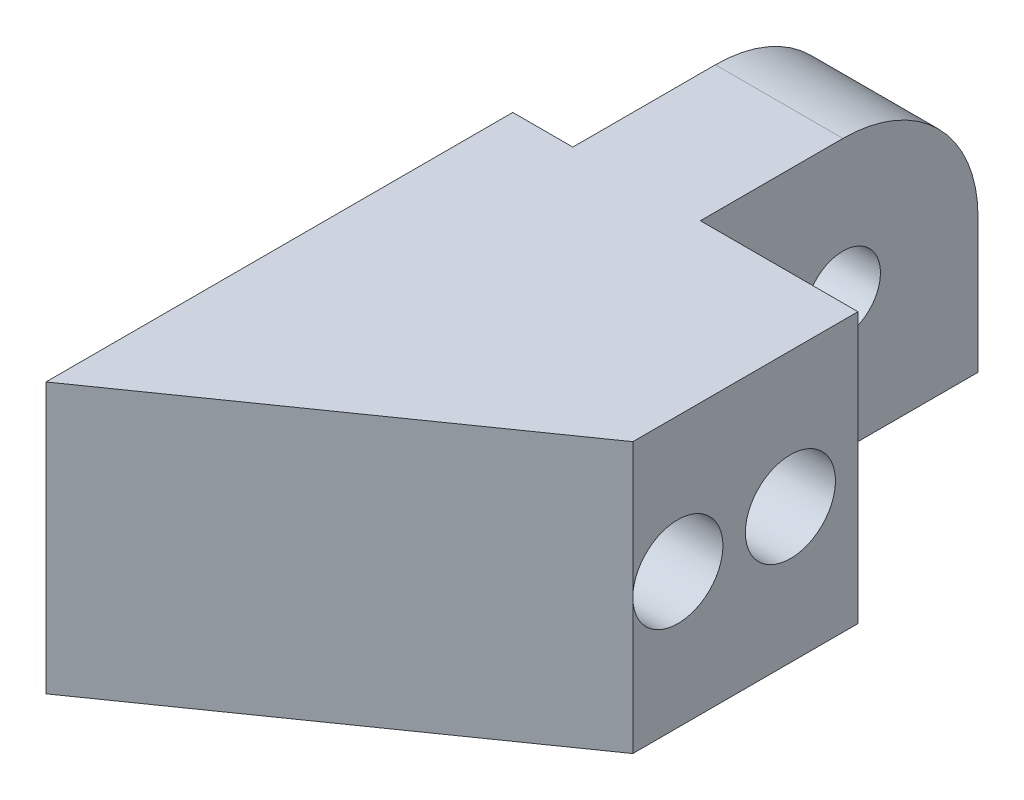
ISO-10303-21;
HEADER;
FILE_DESCRIPTION(('STEP AP214'),'2;1');
FILE_NAME('part.step','',(''),(''),'','','');
FILE_SCHEMA(('AUTOMOTIVE_DESIGN { 1 0 10303 214 1 1 1 1 }'));
ENDSEC;
DATA;
#1=APPLICATION_CONTEXT('core data for automotive mechanical design processes');
#2=APPLICATION_PROTOCOL_DEFINITION('international standard','automotive_design',2000,#1);
#3=PRODUCT_CONTEXT('',#1,'mechanical');
#4=PRODUCT('Part','Part','',(#3));
#5=PRODUCT_RELATED_PRODUCT_CATEGORY('part','',(#4));
#6=PRODUCT_DEFINITION_FORMATION('','',#4);
#7=PRODUCT_DEFINITION_CONTEXT('part definition',#1,'design');
#8=PRODUCT_DEFINITION('design','',#6,#7);
#9=PRODUCT_DEFINITION_SHAPE('','',#8);
#10=(LENGTH_UNIT() NAMED_UNIT(*) SI_UNIT(.MILLI.,.METRE.));
#11=(NAMED_UNIT(*) PLANE_ANGLE_UNIT() SI_UNIT($,.RADIAN.));
#12=(NAMED_UNIT(*) SI_UNIT($,.STERADIAN.) SOLID_ANGLE_UNIT());
#13=UNCERTAINTY_MEASURE_WITH_UNIT(LENGTH_MEASURE(1.E-05),#10,'distance_accuracy_value','');
#14=(GEOMETRIC_REPRESENTATION_CONTEXT(3) GLOBAL_UNCERTAINTY_ASSIGNED_CONTEXT((#13)) GLOBAL_UNIT_ASSIGNED_CONTEXT((#10,
#11,#12)) REPRESENTATION_CONTEXT('',''));
#15=CARTESIAN_POINT('',(0.,0.,0.));
#16=DIRECTION('',(0.,0.,1.));
#17=DIRECTION('',(1.,0.,0.));
#18=AXIS2_PLACEMENT_3D('',#15,#16,#17);
#19=CARTESIAN_POINT('',(-4.25000000000001,18.,-7.5));
#20=DIRECTION('',(0.,0.,1.));
#21=DIRECTION('',(1.,0.,0.));
#22=AXIS2_PLACEMENT_3D('',#19,#20,#21);
#23=PLANE('',#22);
#24=DIRECTION('',(-1.,0.,0.));
#25=VECTOR('',#24,1.);
#26=CARTESIAN_POINT('',(-4.25000000000001,0.,-7.5));
#27=LINE('',#26,#25);
#28=CARTESIAN_POINT('',(-4.25000000000001,0.,-7.5));
#29=VERTEX_POINT('',#28);
#30=CARTESIAN_POINT('',(-8.25000000000001,0.,-7.49999999999999));
#31=VERTEX_POINT('',#30);
#32=EDGE_CURVE('E156',#29,#31,#27,.T.);
#33=ORIENTED_EDGE('',*,*,#32,.T.);
#34=DIRECTION('',(0.,-1.,0.));
#35=VECTOR('',#34,1.);
#36=CARTESIAN_POINT('',(-8.25000000000001,18.,-7.49999999999999));
#37=LINE('',#36,#35);
#38=CARTESIAN_POINT('',(-8.25000000000001,18.,-7.49999999999999));
#39=VERTEX_POINT('',#38);
#40=EDGE_CURVE('E41',#39,#31,#37,.T.);
#41=ORIENTED_EDGE('',*,*,#40,.F.);
#42=DIRECTION('',(-1.,0.,0.));
#43=VECTOR('',#42,1.);
#44=CARTESIAN_POINT('',(-4.25000000000001,18.,-7.5));
#45=LINE('',#44,#43);
#46=CARTESIAN_POINT('',(-4.25000000000001,18.,-7.5));
#47=VERTEX_POINT('',#46);
#48=EDGE_CURVE('E180',#47,#39,#45,.T.);
#49=ORIENTED_EDGE('',*,*,#48,.F.);
#50=DIRECTION('',(0.,-1.,0.));
#51=VECTOR('',#50,1.);
#52=CARTESIAN_POINT('',(-4.25000000000001,18.,-7.5));
#53=LINE('',#52,#51);
#54=EDGE_CURVE('E130',#47,#29,#53,.T.);
#55=ORIENTED_EDGE('',*,*,#54,.T.);
#56=EDGE_LOOP('',(#33,#41,#49,#55));
#57=FACE_BOUND('',#56,.T.);
#58=ADVANCED_FACE('F33',(#57),#23,.F.);
#59=CARTESIAN_POINT('',(-8.25000000000001,18.,-7.49999999999999));
#60=DIRECTION('',(1.,0.,0.));
#61=DIRECTION('',(0.,0.,-1.));
#62=AXIS2_PLACEMENT_3D('',#59,#60,#61);
#63=PLANE('',#62);
#64=CARTESIAN_POINT('',(-8.25000000000001,9.,4.5));
#65=DIRECTION('',(-1.,0.,0.));
#66=DIRECTION('',(0.,0.,1.));
#67=AXIS2_PLACEMENT_3D('',#64,#65,#66);
#68=CIRCLE('',#67,3.);
#69=CARTESIAN_POINT('',(-8.25000000000001,9.,7.50000000000001));
#70=VERTEX_POINT('',#69);
#71=EDGE_CURVE('E194',#70,#70,#68,.T.);
#72=ORIENTED_EDGE('',*,*,#71,.F.);
#73=EDGE_LOOP('',(#72));
#74=FACE_BOUND('',#73,.T.);
#75=CARTESIAN_POINT('',(-8.25000000000001,9.,-2.99999999999999));
#76=DIRECTION('',(-1.,0.,0.));
#77=DIRECTION('',(0.,0.,1.));
#78=AXIS2_PLACEMENT_3D('',#75,#76,#77);
#79=CIRCLE('',#78,3.);
#80=CARTESIAN_POINT('',(-8.25000000000001,9.,0.));
#81=VERTEX_POINT('',#80);
#82=EDGE_CURVE('E198',#81,#81,#79,.T.);
#83=ORIENTED_EDGE('',*,*,#82,.F.);
#84=EDGE_LOOP('',(#83));
#85=FACE_BOUND('',#84,.T.);
#86=DIRECTION('',(0.,0.,1.));
#87=VECTOR('',#86,1.);
#88=CARTESIAN_POINT('',(-8.25000000000001,0.,-7.49999999999999));
#89=LINE('',#88,#87);
#90=CARTESIAN_POINT('',(-8.25,0.,23.6047733788235));
#91=VERTEX_POINT('',#90);
#92=EDGE_CURVE('E149',#31,#91,#89,.T.);
#93=ORIENTED_EDGE('',*,*,#92,.T.);
#94=DIRECTION('',(0.,-1.,0.));
#95=VECTOR('',#94,1.);
#96=CARTESIAN_POINT('',(-8.25,18.,23.6047733788235));
#97=LINE('',#96,#95);
#98=CARTESIAN_POINT('',(-8.25,18.,23.6047733788235));
#99=VERTEX_POINT('',#98);
#100=EDGE_CURVE('E140',#99,#91,#97,.T.);
#101=ORIENTED_EDGE('',*,*,#100,.F.);
#102=DIRECTION('',(0.,0.,1.));
#103=VECTOR('',#102,1.);
#104=CARTESIAN_POINT('',(-8.25000000000001,18.,-7.49999999999999));
#105=LINE('',#104,#103);
#106=EDGE_CURVE('E150',#39,#99,#105,.T.);
#107=ORIENTED_EDGE('',*,*,#106,.F.);
#108=ORIENTED_EDGE('',*,*,#40,.T.);
#109=EDGE_LOOP('',(#93,#101,#107,#108));
#110=FACE_BOUND('',#109,.T.);
#111=ADVANCED_FACE('F147',(#74,#85,#110),#63,.F.);
#112=CARTESIAN_POINT('',(-8.25,18.,23.6047733788235));
#113=DIRECTION('',(-0.57357643635105,0.,-0.819152044288989));
#114=DIRECTION('',(-0.819152044288989,0.,0.57357643635105));
#115=AXIS2_PLACEMENT_3D('',#112,#113,#114);
#116=PLANE('',#115);
#117=DIRECTION('',(0.819152044288989,0.,-0.57357643635105));
#118=VECTOR('',#117,1.);
#119=CARTESIAN_POINT('',(-8.25,0.,23.6047733788235));
#120=LINE('',#119,#118);
#121=CARTESIAN_POINT('',(14.75,0.,7.5));
#122=VERTEX_POINT('',#121);
#123=EDGE_CURVE('E162',#91,#122,#120,.T.);
#124=ORIENTED_EDGE('',*,*,#123,.T.);
#125=DIRECTION('',(0.,-1.,0.));
#126=VECTOR('',#125,1.);
#127=CARTESIAN_POINT('',(14.75,18.,7.5));
#128=LINE('',#127,#126);
#129=CARTESIAN_POINT('',(14.75,9.,7.5));
#130=VERTEX_POINT('',#129);
#131=EDGE_CURVE('E136',#130,#122,#128,.T.);
#132=ORIENTED_EDGE('',*,*,#131,.F.);
#133=CARTESIAN_POINT('',(14.75,18.,7.5));
#134=VERTEX_POINT('',#133);
#135=EDGE_CURVE('E137',#134,#130,#128,.T.);
#136=ORIENTED_EDGE('',*,*,#135,.F.);
#137=DIRECTION('',(0.819152044288989,0.,-0.57357643635105));
#138=VECTOR('',#137,1.);
#139=CARTESIAN_POINT('',(-8.25,18.,23.6047733788235));
#140=LINE('',#139,#138);
#141=EDGE_CURVE('E189',#99,#134,#140,.T.);
#142=ORIENTED_EDGE('',*,*,#141,.F.);
#143=ORIENTED_EDGE('',*,*,#100,.T.);
#144=EDGE_LOOP('',(#124,#132,#136,#142,#143));
#145=FACE_BOUND('',#144,.T.);
#146=ADVANCED_FACE('F216',(#145),#116,.F.);
#147=CARTESIAN_POINT('',(14.75,18.,7.5));
#148=DIRECTION('',(-1.,0.,0.));
#149=DIRECTION('',(0.,0.,1.));
#150=AXIS2_PLACEMENT_3D('',#147,#148,#149);
#151=PLANE('',#150);
#152=CARTESIAN_POINT('',(14.75,9.,-3.));
#153=DIRECTION('',(-1.,0.,0.));
#154=DIRECTION('',(0.,0.,1.));
#155=AXIS2_PLACEMENT_3D('',#152,#153,#154);
#156=CIRCLE('',#155,3.);
#157=CARTESIAN_POINT('',(14.75,9.,0.));
#158=VERTEX_POINT('',#157);
#159=EDGE_CURVE('E119',#158,#158,#156,.T.);
#160=ORIENTED_EDGE('',*,*,#159,.T.);
#161=EDGE_LOOP('',(#160));
#162=FACE_BOUND('',#161,.T.);
#163=ORIENTED_EDGE('',*,*,#135,.T.);
#164=CARTESIAN_POINT('',(14.75,9.,4.5));
#165=DIRECTION('',(-1.,0.,0.));
#166=DIRECTION('',(0.,0.,1.));
#167=AXIS2_PLACEMENT_3D('',#164,#165,#166);
#168=CIRCLE('',#167,3.);
#169=EDGE_CURVE('E46',#130,#130,#168,.T.);
#170=ORIENTED_EDGE('',*,*,#169,.T.);
#171=ORIENTED_EDGE('',*,*,#131,.T.);
#172=DIRECTION('',(0.,0.,-1.));
#173=VECTOR('',#172,1.);
#174=CARTESIAN_POINT('',(14.75,0.,7.5));
#175=LINE('',#174,#173);
#176=CARTESIAN_POINT('',(14.75,0.,-7.5));
#177=VERTEX_POINT('',#176);
#178=EDGE_CURVE('E172',#122,#177,#175,.T.);
#179=ORIENTED_EDGE('',*,*,#178,.T.);
#180=DIRECTION('',(0.,-1.,0.));
#181=VECTOR('',#180,1.);
#182=CARTESIAN_POINT('',(14.75,18.,-7.5));
#183=LINE('',#182,#181);
#184=CARTESIAN_POINT('',(14.75,18.,-7.5));
#185=VERTEX_POINT('',#184);
#186=EDGE_CURVE('E128',#185,#177,#183,.T.);
#187=ORIENTED_EDGE('',*,*,#186,.F.);
#188=DIRECTION('',(0.,0.,-1.));
#189=VECTOR('',#188,1.);
#190=CARTESIAN_POINT('',(14.75,18.,7.5));
#191=LINE('',#190,#189);
#192=EDGE_CURVE('E185',#134,#185,#191,.T.);
#193=ORIENTED_EDGE('',*,*,#192,.F.);
#194=EDGE_LOOP('',(#163,#170,#171,#179,#187,#193));
#195=FACE_BOUND('',#194,.T.);
#196=ADVANCED_FACE('F204',(#162,#195),#151,.F.);
#197=CARTESIAN_POINT('',(14.75,18.,-7.5));
#198=DIRECTION('',(0.,0.,1.));
#199=DIRECTION('',(1.,0.,0.));
#200=AXIS2_PLACEMENT_3D('',#197,#198,#199);
#201=PLANE('',#200);
#202=DIRECTION('',(-1.,0.,0.));
#203=VECTOR('',#202,1.);
#204=CARTESIAN_POINT('',(14.75,0.,-7.5));
#205=LINE('',#204,#203);
#206=CARTESIAN_POINT('',(4.25,0.,-7.5));
#207=VERTEX_POINT('',#206);
#208=EDGE_CURVE('E174',#177,#207,#205,.T.);
#209=ORIENTED_EDGE('',*,*,#208,.T.);
#210=DIRECTION('',(0.,-1.,0.));
#211=VECTOR('',#210,1.);
#212=CARTESIAN_POINT('',(4.25,18.,-7.5));
#213=LINE('',#212,#211);
#214=CARTESIAN_POINT('',(4.25,18.,-7.5));
#215=VERTEX_POINT('',#214);
#216=EDGE_CURVE('E126',#215,#207,#213,.T.);
#217=ORIENTED_EDGE('',*,*,#216,.F.);
#218=DIRECTION('',(-1.,0.,0.));
#219=VECTOR('',#218,1.);
#220=CARTESIAN_POINT('',(14.75,18.,-7.5));
#221=LINE('',#220,#219);
#222=EDGE_CURVE('E184',#185,#215,#221,.T.);
#223=ORIENTED_EDGE('',*,*,#222,.F.);
#224=ORIENTED_EDGE('',*,*,#186,.T.);
#225=EDGE_LOOP('',(#209,#217,#223,#224));
#226=FACE_BOUND('',#225,.T.);
#227=ADVANCED_FACE('F228',(#226),#201,.F.);
#228=CARTESIAN_POINT('',(4.25,18.,-7.5));
#229=DIRECTION('',(-1.,0.,0.));
#230=DIRECTION('',(0.,0.,1.));
#231=AXIS2_PLACEMENT_3D('',#228,#229,#230);
#232=PLANE('',#231);
#233=CARTESIAN_POINT('',(4.25,9.,-17.));
#234=DIRECTION('',(-1.,0.,0.));
#235=DIRECTION('',(0.,0.,1.));
#236=AXIS2_PLACEMENT_3D('',#233,#234,#235);
#237=CIRCLE('',#236,2.5);
#238=CARTESIAN_POINT('',(4.25,9.,-14.5));
#239=VERTEX_POINT('',#238);
#240=EDGE_CURVE('E160',#239,#239,#237,.T.);
#241=ORIENTED_EDGE('',*,*,#240,.T.);
#242=EDGE_LOOP('',(#241));
#243=FACE_BOUND('',#242,.T.);
#244=DIRECTION('',(0.,-1.,0.));
#245=VECTOR('',#244,1.);
#246=CARTESIAN_POINT('',(4.24999999999999,18.,-26.));
#247=LINE('',#246,#245);
#248=CARTESIAN_POINT('',(4.24999999999999,9.,-26.));
#249=VERTEX_POINT('',#248);
#250=CARTESIAN_POINT('',(4.24999999999999,0.,-26.));
#251=VERTEX_POINT('',#250);
#252=EDGE_CURVE('E116',#249,#251,#247,.T.);
#253=ORIENTED_EDGE('',*,*,#252,.F.);
#254=CARTESIAN_POINT('',(4.25,9.,-17.));
#255=DIRECTION('',(-1.,0.,0.));
#256=DIRECTION('',(0.,0.,1.));
#257=AXIS2_PLACEMENT_3D('',#254,#255,#256);
#258=CIRCLE('',#257,9.);
#259=CARTESIAN_POINT('',(4.25,18.,-17.));
#260=VERTEX_POINT('',#259);
#261=EDGE_CURVE('E103',#249,#260,#258,.F.);
#262=ORIENTED_EDGE('',*,*,#261,.T.);
#263=DIRECTION('',(0.,0.,-1.));
#264=VECTOR('',#263,1.);
#265=CARTESIAN_POINT('',(4.25,18.,-7.5));
#266=LINE('',#265,#264);
#267=EDGE_CURVE('E181',#215,#260,#266,.T.);
#268=ORIENTED_EDGE('',*,*,#267,.F.);
#269=ORIENTED_EDGE('',*,*,#216,.T.);
#270=DIRECTION('',(0.,0.,-1.));
#271=VECTOR('',#270,1.);
#272=CARTESIAN_POINT('',(4.25,0.,-7.5));
#273=LINE('',#272,#271);
#274=EDGE_CURVE('E124',#207,#251,#273,.T.);
#275=ORIENTED_EDGE('',*,*,#274,.T.);
#276=EDGE_LOOP('',(#253,#262,#268,#269,#275));
#277=FACE_BOUND('',#276,.T.);
#278=ADVANCED_FACE('F121',(#243,#277),#232,.F.);
#279=CARTESIAN_POINT('',(4.24999999999999,18.,-26.));
#280=DIRECTION('',(0.,0.,1.));
#281=DIRECTION('',(1.,0.,0.));
#282=AXIS2_PLACEMENT_3D('',#279,#280,#281);
#283=PLANE('',#282);
#284=DIRECTION('',(0.,-1.,0.));
#285=VECTOR('',#284,1.);
#286=CARTESIAN_POINT('',(-4.25000000000001,18.,-26.));
#287=LINE('',#286,#285);
#288=CARTESIAN_POINT('',(-4.25000000000001,9.,-26.));
#289=VERTEX_POINT('',#288);
#290=CARTESIAN_POINT('',(-4.25000000000001,0.,-26.));
#291=VERTEX_POINT('',#290);
#292=EDGE_CURVE('E118',#289,#291,#287,.T.);
#293=ORIENTED_EDGE('',*,*,#292,.F.);
#294=DIRECTION('',(-1.,0.,0.));
#295=VECTOR('',#294,1.);
#296=CARTESIAN_POINT('',(14.75,9.,-26.));
#297=LINE('',#296,#295);
#298=EDGE_CURVE('E106',#249,#289,#297,.T.);
#299=ORIENTED_EDGE('',*,*,#298,.F.);
#300=ORIENTED_EDGE('',*,*,#252,.T.);
#301=DIRECTION('',(-1.,0.,0.));
#302=VECTOR('',#301,1.);
#303=CARTESIAN_POINT('',(4.24999999999999,0.,-26.));
#304=LINE('',#303,#302);
#305=EDGE_CURVE('E177',#251,#291,#304,.T.);
#306=ORIENTED_EDGE('',*,*,#305,.T.);
#307=EDGE_LOOP('',(#293,#299,#300,#306));
#308=FACE_BOUND('',#307,.T.);
#309=ADVANCED_FACE('F114',(#308),#283,.F.);
#310=CARTESIAN_POINT('',(-4.25000000000001,18.,-26.));
#311=DIRECTION('',(1.,0.,0.));
#312=DIRECTION('',(0.,0.,-1.));
#313=AXIS2_PLACEMENT_3D('',#310,#311,#312);
#314=PLANE('',#313);
#315=CARTESIAN_POINT('',(-4.25000000000001,9.,-17.));
#316=DIRECTION('',(1.,0.,0.));
#317=DIRECTION('',(0.,0.,-1.));
#318=AXIS2_PLACEMENT_3D('',#315,#316,#317);
#319=CIRCLE('',#318,2.5);
#320=CARTESIAN_POINT('',(-4.25000000000001,9.,-19.5));
#321=VERTEX_POINT('',#320);
#322=EDGE_CURVE('E36',#321,#321,#319,.T.);
#323=ORIENTED_EDGE('',*,*,#322,.T.);
#324=EDGE_LOOP('',(#323));
#325=FACE_BOUND('',#324,.T.);
#326=DIRECTION('',(0.,0.,1.));
#327=VECTOR('',#326,1.);
#328=CARTESIAN_POINT('',(-4.25000000000001,18.,-26.));
#329=LINE('',#328,#327);
#330=CARTESIAN_POINT('',(-4.25000000000001,18.,-17.));
#331=VERTEX_POINT('',#330);
#332=EDGE_CURVE('E167',#331,#47,#329,.T.);
#333=ORIENTED_EDGE('',*,*,#332,.F.);
#334=CARTESIAN_POINT('',(-4.25000000000001,9.,-17.));
#335=DIRECTION('',(1.,0.,0.));
#336=DIRECTION('',(0.,0.,-1.));
#337=AXIS2_PLACEMENT_3D('',#334,#335,#336);
#338=CIRCLE('',#337,9.);
#339=EDGE_CURVE('E52',#331,#289,#338,.F.);
#340=ORIENTED_EDGE('',*,*,#339,.T.);
#341=ORIENTED_EDGE('',*,*,#292,.T.);
#342=DIRECTION('',(0.,0.,1.));
#343=VECTOR('',#342,1.);
#344=CARTESIAN_POINT('',(-4.25000000000001,0.,-26.));
#345=LINE('',#344,#343);
#346=EDGE_CURVE('E179',#291,#29,#345,.T.);
#347=ORIENTED_EDGE('',*,*,#346,.T.);
#348=ORIENTED_EDGE('',*,*,#54,.F.);
#349=EDGE_LOOP('',(#333,#340,#341,#347,#348));
#350=FACE_BOUND('',#349,.T.);
#351=ADVANCED_FACE('F237',(#325,#350),#314,.F.);
#352=CARTESIAN_POINT('',(0.,18.,0.));
#353=DIRECTION('',(0.,1.,0.));
#354=DIRECTION('',(0.,0.,1.));
#355=AXIS2_PLACEMENT_3D('',#352,#353,#354);
#356=PLANE('',#355);
#357=DIRECTION('',(-1.,0.,0.));
#358=VECTOR('',#357,1.);
#359=CARTESIAN_POINT('',(14.75,18.,-17.));
#360=LINE('',#359,#358);
#361=EDGE_CURVE('E11',#331,#260,#360,.F.);
#362=ORIENTED_EDGE('',*,*,#361,.F.);
#363=ORIENTED_EDGE('',*,*,#332,.T.);
#364=ORIENTED_EDGE('',*,*,#48,.T.);
#365=ORIENTED_EDGE('',*,*,#106,.T.);
#366=ORIENTED_EDGE('',*,*,#141,.T.);
#367=ORIENTED_EDGE('',*,*,#192,.T.);
#368=ORIENTED_EDGE('',*,*,#222,.T.);
#369=ORIENTED_EDGE('',*,*,#267,.T.);
#370=EDGE_LOOP('',(#362,#363,#364,#365,#366,#367,#368,#369));
#371=FACE_BOUND('',#370,.T.);
#372=ADVANCED_FACE('F240',(#371),#356,.T.);
#373=CARTESIAN_POINT('',(0.,0.,0.));
#374=DIRECTION('',(0.,1.,0.));
#375=DIRECTION('',(0.,0.,1.));
#376=AXIS2_PLACEMENT_3D('',#373,#374,#375);
#377=PLANE('',#376);
#378=ORIENTED_EDGE('',*,*,#32,.F.);
#379=ORIENTED_EDGE('',*,*,#346,.F.);
#380=ORIENTED_EDGE('',*,*,#305,.F.);
#381=ORIENTED_EDGE('',*,*,#274,.F.);
#382=ORIENTED_EDGE('',*,*,#208,.F.);
#383=ORIENTED_EDGE('',*,*,#178,.F.);
#384=ORIENTED_EDGE('',*,*,#123,.F.);
#385=ORIENTED_EDGE('',*,*,#92,.F.);
#386=EDGE_LOOP('',(#378,#379,#380,#381,#382,#383,#384,#385));
#387=FACE_BOUND('',#386,.T.);
#388=ADVANCED_FACE('F242',(#387),#377,.F.);
#389=CARTESIAN_POINT('',(14.75,9.,-17.));
#390=DIRECTION('',(-1.,0.,0.));
#391=DIRECTION('',(0.,0.,1.));
#392=AXIS2_PLACEMENT_3D('',#389,#390,#391);
#393=CYLINDRICAL_SURFACE('',#392,9.);
#394=ORIENTED_EDGE('',*,*,#298,.T.);
#395=ORIENTED_EDGE('',*,*,#339,.F.);
#396=ORIENTED_EDGE('',*,*,#361,.T.);
#397=ORIENTED_EDGE('',*,*,#261,.F.);
#398=EDGE_LOOP('',(#394,#395,#396,#397));
#399=FACE_BOUND('',#398,.T.);
#400=ADVANCED_FACE('F105',(#399),#393,.T.);
#401=CARTESIAN_POINT('',(14.75,9.,-17.));
#402=DIRECTION('',(-1.,0.,0.));
#403=DIRECTION('',(0.,0.,1.));
#404=AXIS2_PLACEMENT_3D('',#401,#402,#403);
#405=CYLINDRICAL_SURFACE('',#404,2.5);
#406=ORIENTED_EDGE('',*,*,#322,.F.);
#407=EDGE_LOOP('',(#406));
#408=FACE_BOUND('',#407,.T.);
#409=ORIENTED_EDGE('',*,*,#240,.F.);
#410=EDGE_LOOP('',(#409));
#411=FACE_BOUND('',#410,.T.);
#412=ADVANCED_FACE('F211',(#408,#411),#405,.F.);
#413=CARTESIAN_POINT('',(14.75,9.,-3.));
#414=DIRECTION('',(-1.,0.,0.));
#415=DIRECTION('',(0.,0.,1.));
#416=AXIS2_PLACEMENT_3D('',#413,#414,#415);
#417=CYLINDRICAL_SURFACE('',#416,3.);
#418=ORIENTED_EDGE('',*,*,#159,.F.);
#419=EDGE_LOOP('',(#418));
#420=FACE_BOUND('',#419,.T.);
#421=ORIENTED_EDGE('',*,*,#82,.T.);
#422=EDGE_LOOP('',(#421));
#423=FACE_BOUND('',#422,.T.);
#424=ADVANCED_FACE('F207',(#420,#423),#417,.F.);
#425=CARTESIAN_POINT('',(14.75,9.,4.5));
#426=DIRECTION('',(-1.,0.,0.));
#427=DIRECTION('',(0.,0.,1.));
#428=AXIS2_PLACEMENT_3D('',#425,#426,#427);
#429=CYLINDRICAL_SURFACE('',#428,3.);
#430=ORIENTED_EDGE('',*,*,#169,.F.);
#431=EDGE_LOOP('',(#430));
#432=FACE_BOUND('',#431,.T.);
#433=ORIENTED_EDGE('',*,*,#71,.T.);
#434=EDGE_LOOP('',(#433));
#435=FACE_BOUND('',#434,.T.);
#436=ADVANCED_FACE('F210',(#432,#435),#429,.F.);
#437=CLOSED_SHELL('',(#58,#111,#146,#196,#227,#278,#309,#351,#372,#388,#400,#412,#424,#436));
#438=MANIFOLD_SOLID_BREP('B2',#437);
#439=ADVANCED_BREP_SHAPE_REPRESENTATION('',(#18,#438),#14);
#440=SHAPE_DEFINITION_REPRESENTATION(#9,#439);
ENDSEC;
END-ISO-10303-21;
